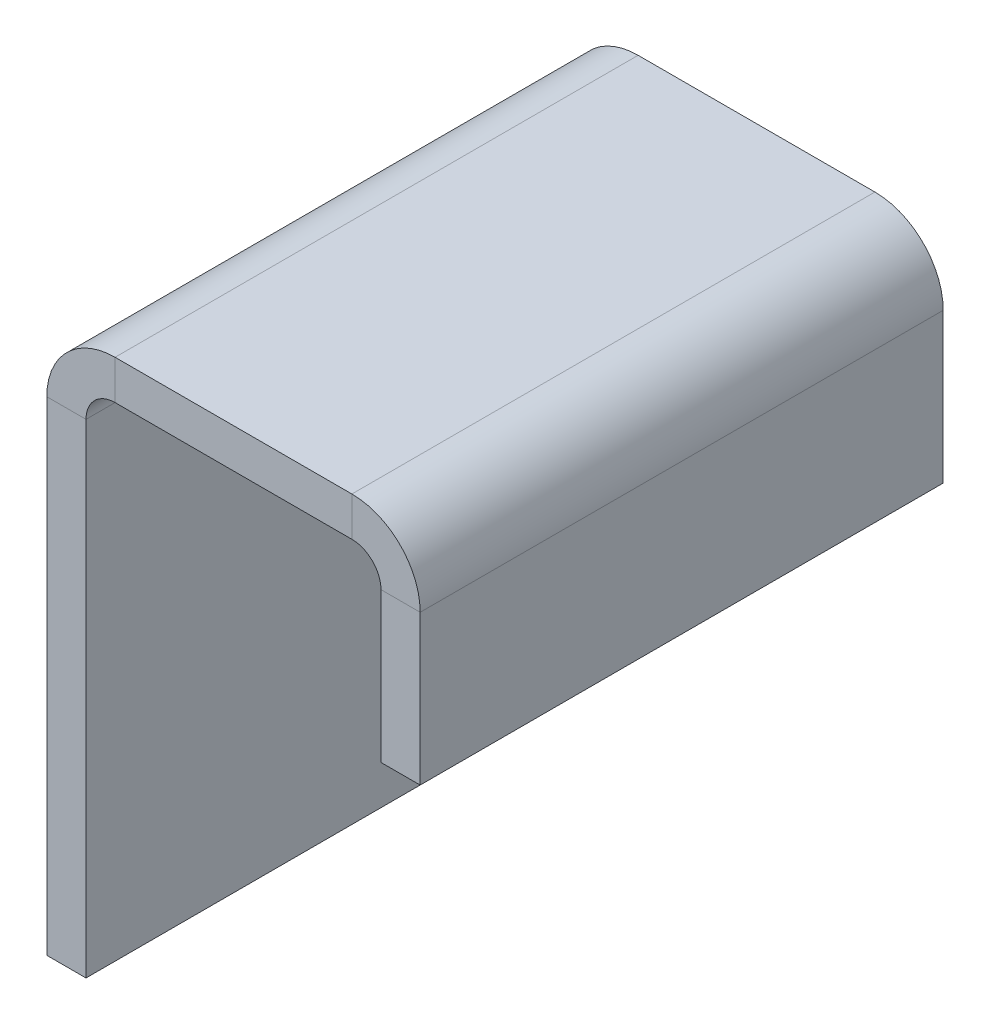
ISO-10303-21;
HEADER;
FILE_DESCRIPTION(('STEP AP214'),'2;1');
FILE_NAME('part.step','',(''),(''),'','','');
FILE_SCHEMA(('AUTOMOTIVE_DESIGN { 1 0 10303 214 1 1 1 1 }'));
ENDSEC;
DATA;
#1=APPLICATION_CONTEXT('core data for automotive mechanical design processes');
#2=APPLICATION_PROTOCOL_DEFINITION('international standard','automotive_design',2000,#1);
#3=PRODUCT_CONTEXT('',#1,'mechanical');
#4=PRODUCT('Part','Part','',(#3));
#5=PRODUCT_RELATED_PRODUCT_CATEGORY('part','',(#4));
#6=PRODUCT_DEFINITION_FORMATION('','',#4);
#7=PRODUCT_DEFINITION_CONTEXT('part definition',#1,'design');
#8=PRODUCT_DEFINITION('design','',#6,#7);
#9=PRODUCT_DEFINITION_SHAPE('','',#8);
#10=(LENGTH_UNIT() NAMED_UNIT(*) SI_UNIT(.MILLI.,.METRE.));
#11=(NAMED_UNIT(*) PLANE_ANGLE_UNIT() SI_UNIT($,.RADIAN.));
#12=(NAMED_UNIT(*) SI_UNIT($,.STERADIAN.) SOLID_ANGLE_UNIT());
#13=UNCERTAINTY_MEASURE_WITH_UNIT(LENGTH_MEASURE(1.E-05),#10,'distance_accuracy_value','');
#14=(GEOMETRIC_REPRESENTATION_CONTEXT(3) GLOBAL_UNCERTAINTY_ASSIGNED_CONTEXT((#13)) GLOBAL_UNIT_ASSIGNED_CONTEXT((#10,
#11,#12)) REPRESENTATION_CONTEXT('',''));
#15=CARTESIAN_POINT('',(0.,0.,0.));
#16=DIRECTION('',(0.,0.,1.));
#17=DIRECTION('',(1.,0.,0.));
#18=AXIS2_PLACEMENT_3D('',#15,#16,#17);
#19=CARTESIAN_POINT('',(4.7,38.,36.));
#20=DIRECTION('',(0.,0.,1.));
#21=DIRECTION('',(1.,0.,0.));
#22=AXIS2_PLACEMENT_3D('',#19,#20,#21);
#23=PLANE('',#22);
#24=DIRECTION('',(0.,-1.,0.));
#25=VECTOR('',#24,1.);
#26=CARTESIAN_POINT('',(4.7,38.,36.));
#27=LINE('',#26,#25);
#28=CARTESIAN_POINT('',(4.7,38.,36.));
#29=VERTEX_POINT('',#28);
#30=CARTESIAN_POINT('',(4.7,35.3,36.));
#31=VERTEX_POINT('',#30);
#32=EDGE_CURVE('E11',#29,#31,#27,.T.);
#33=ORIENTED_EDGE('',*,*,#32,.F.);
#34=CARTESIAN_POINT('',(4.7,33.3,36.));
#35=DIRECTION('',(0.,0.,1.));
#36=DIRECTION('',(1.,0.,0.));
#37=AXIS2_PLACEMENT_3D('',#34,#35,#36);
#38=CIRCLE('',#37,4.7);
#39=CARTESIAN_POINT('',(0.,33.3,36.));
#40=VERTEX_POINT('',#39);
#41=EDGE_CURVE('E245',#40,#29,#38,.F.);
#42=ORIENTED_EDGE('',*,*,#41,.F.);
#43=DIRECTION('',(-1.,0.,0.));
#44=VECTOR('',#43,1.);
#45=CARTESIAN_POINT('',(2.7,33.3,36.));
#46=LINE('',#45,#44);
#47=CARTESIAN_POINT('',(2.7,33.3,36.));
#48=VERTEX_POINT('',#47);
#49=EDGE_CURVE('E43',#48,#40,#46,.T.);
#50=ORIENTED_EDGE('',*,*,#49,.F.);
#51=CARTESIAN_POINT('',(4.7,33.3,36.));
#52=DIRECTION('',(0.,0.,1.));
#53=DIRECTION('',(1.,0.,0.));
#54=AXIS2_PLACEMENT_3D('',#51,#52,#53);
#55=CIRCLE('',#54,2.);
#56=EDGE_CURVE('E144',#48,#31,#55,.F.);
#57=ORIENTED_EDGE('',*,*,#56,.T.);
#58=EDGE_LOOP('',(#33,#42,#50,#57));
#59=FACE_BOUND('',#58,.T.);
#60=ADVANCED_FACE('F35',(#59),#23,.T.);
#61=CARTESIAN_POINT('',(2.7,33.3,36.));
#62=DIRECTION('',(0.,0.,1.));
#63=DIRECTION('',(1.,0.,0.));
#64=AXIS2_PLACEMENT_3D('',#61,#62,#63);
#65=PLANE('',#64);
#66=DIRECTION('',(1.,0.,0.));
#67=VECTOR('',#66,1.);
#68=CARTESIAN_POINT('',(0.,38.,36.));
#69=LINE('',#68,#67);
#70=CARTESIAN_POINT('',(21.,38.,36.));
#71=VERTEX_POINT('',#70);
#72=EDGE_CURVE('E138',#29,#71,#69,.T.);
#73=ORIENTED_EDGE('',*,*,#72,.F.);
#74=ORIENTED_EDGE('',*,*,#32,.T.);
#75=DIRECTION('',(1.,0.,0.));
#76=VECTOR('',#75,1.);
#77=CARTESIAN_POINT('',(0.,35.3,36.));
#78=LINE('',#77,#76);
#79=CARTESIAN_POINT('',(21.,35.3,36.));
#80=VERTEX_POINT('',#79);
#81=EDGE_CURVE('E135',#31,#80,#78,.T.);
#82=ORIENTED_EDGE('',*,*,#81,.T.);
#83=DIRECTION('',(0.,1.,0.));
#84=VECTOR('',#83,1.);
#85=CARTESIAN_POINT('',(21.,35.3,36.));
#86=LINE('',#85,#84);
#87=EDGE_CURVE('E226',#80,#71,#86,.T.);
#88=ORIENTED_EDGE('',*,*,#87,.T.);
#89=EDGE_LOOP('',(#73,#74,#82,#88));
#90=FACE_BOUND('',#89,.T.);
#91=ADVANCED_FACE('F133',(#90),#65,.T.);
#92=CARTESIAN_POINT('',(0.,33.3,0.));
#93=DIRECTION('',(0.,0.,-1.));
#94=DIRECTION('',(-1.,0.,0.));
#95=AXIS2_PLACEMENT_3D('',#92,#93,#94);
#96=PLANE('',#95);
#97=DIRECTION('',(1.,0.,0.));
#98=VECTOR('',#97,1.);
#99=CARTESIAN_POINT('',(0.,33.3,0.));
#100=LINE('',#99,#98);
#101=CARTESIAN_POINT('',(0.,33.3,0.));
#102=VERTEX_POINT('',#101);
#103=CARTESIAN_POINT('',(2.7,33.3,0.));
#104=VERTEX_POINT('',#103);
#105=EDGE_CURVE('E231',#102,#104,#100,.T.);
#106=ORIENTED_EDGE('',*,*,#105,.F.);
#107=CARTESIAN_POINT('',(4.7,33.3,0.));
#108=DIRECTION('',(0.,0.,1.));
#109=DIRECTION('',(1.,0.,0.));
#110=AXIS2_PLACEMENT_3D('',#107,#108,#109);
#111=CIRCLE('',#110,4.7);
#112=CARTESIAN_POINT('',(4.7,38.,0.));
#113=VERTEX_POINT('',#112);
#114=EDGE_CURVE('E183',#102,#113,#111,.F.);
#115=ORIENTED_EDGE('',*,*,#114,.T.);
#116=DIRECTION('',(0.,1.,0.));
#117=VECTOR('',#116,1.);
#118=CARTESIAN_POINT('',(4.7,35.3,0.));
#119=LINE('',#118,#117);
#120=CARTESIAN_POINT('',(4.7,35.3,0.));
#121=VERTEX_POINT('',#120);
#122=EDGE_CURVE('E229',#121,#113,#119,.T.);
#123=ORIENTED_EDGE('',*,*,#122,.F.);
#124=CARTESIAN_POINT('',(4.7,33.3,0.));
#125=DIRECTION('',(0.,0.,1.));
#126=DIRECTION('',(1.,0.,0.));
#127=AXIS2_PLACEMENT_3D('',#124,#125,#126);
#128=CIRCLE('',#127,2.);
#129=EDGE_CURVE('E156',#104,#121,#128,.F.);
#130=ORIENTED_EDGE('',*,*,#129,.F.);
#131=EDGE_LOOP('',(#106,#115,#123,#130));
#132=FACE_BOUND('',#131,.T.);
#133=ADVANCED_FACE('F283',(#132),#96,.T.);
#134=CARTESIAN_POINT('',(4.7,35.3,0.));
#135=DIRECTION('',(0.,0.,-1.));
#136=DIRECTION('',(-1.,0.,0.));
#137=AXIS2_PLACEMENT_3D('',#134,#135,#136);
#138=PLANE('',#137);
#139=DIRECTION('',(0.,1.,0.));
#140=VECTOR('',#139,1.);
#141=CARTESIAN_POINT('',(0.,0.,0.));
#142=LINE('',#141,#140);
#143=CARTESIAN_POINT('',(0.,0.,0.));
#144=VERTEX_POINT('',#143);
#145=EDGE_CURVE('E186',#144,#102,#142,.T.);
#146=ORIENTED_EDGE('',*,*,#145,.T.);
#147=ORIENTED_EDGE('',*,*,#105,.T.);
#148=DIRECTION('',(0.,1.,0.));
#149=VECTOR('',#148,1.);
#150=CARTESIAN_POINT('',(2.7,0.,0.));
#151=LINE('',#150,#149);
#152=CARTESIAN_POINT('',(2.7,0.,0.));
#153=VERTEX_POINT('',#152);
#154=EDGE_CURVE('E192',#153,#104,#151,.T.);
#155=ORIENTED_EDGE('',*,*,#154,.F.);
#156=DIRECTION('',(-1.,0.,0.));
#157=VECTOR('',#156,1.);
#158=CARTESIAN_POINT('',(2.7,0.,0.));
#159=LINE('',#158,#157);
#160=EDGE_CURVE('E189',#153,#144,#159,.T.);
#161=ORIENTED_EDGE('',*,*,#160,.T.);
#162=EDGE_LOOP('',(#146,#147,#155,#161));
#163=FACE_BOUND('',#162,.T.);
#164=ADVANCED_FACE('F286',(#163),#138,.T.);
#165=CARTESIAN_POINT('',(25.7,33.3,36.));
#166=DIRECTION('',(0.,0.,1.));
#167=DIRECTION('',(1.,0.,0.));
#168=AXIS2_PLACEMENT_3D('',#165,#166,#167);
#169=PLANE('',#168);
#170=DIRECTION('',(-1.,0.,0.));
#171=VECTOR('',#170,1.);
#172=CARTESIAN_POINT('',(25.7,33.3,36.));
#173=LINE('',#172,#171);
#174=CARTESIAN_POINT('',(25.7,33.3,36.));
#175=VERTEX_POINT('',#174);
#176=CARTESIAN_POINT('',(23.,33.3,36.));
#177=VERTEX_POINT('',#176);
#178=EDGE_CURVE('E51',#175,#177,#173,.T.);
#179=ORIENTED_EDGE('',*,*,#178,.F.);
#180=CARTESIAN_POINT('',(21.,33.3,36.));
#181=DIRECTION('',(0.,0.,1.));
#182=DIRECTION('',(1.,0.,0.));
#183=AXIS2_PLACEMENT_3D('',#180,#181,#182);
#184=CIRCLE('',#183,4.7);
#185=EDGE_CURVE('E255',#71,#175,#184,.F.);
#186=ORIENTED_EDGE('',*,*,#185,.F.);
#187=ORIENTED_EDGE('',*,*,#87,.F.);
#188=CARTESIAN_POINT('',(21.,33.3,36.));
#189=DIRECTION('',(0.,0.,1.));
#190=DIRECTION('',(1.,0.,0.));
#191=AXIS2_PLACEMENT_3D('',#188,#189,#190);
#192=CIRCLE('',#191,2.);
#193=EDGE_CURVE('E164',#80,#177,#192,.F.);
#194=ORIENTED_EDGE('',*,*,#193,.T.);
#195=EDGE_LOOP('',(#179,#186,#187,#194));
#196=FACE_BOUND('',#195,.T.);
#197=ADVANCED_FACE('F278',(#196),#169,.T.);
#198=CARTESIAN_POINT('',(21.,35.3,36.));
#199=DIRECTION('',(0.,0.,1.));
#200=DIRECTION('',(1.,0.,0.));
#201=AXIS2_PLACEMENT_3D('',#198,#199,#200);
#202=PLANE('',#201);
#203=DIRECTION('',(0.,-1.,0.));
#204=VECTOR('',#203,1.);
#205=CARTESIAN_POINT('',(25.7,38.,36.));
#206=LINE('',#205,#204);
#207=CARTESIAN_POINT('',(25.7,23.,36.));
#208=VERTEX_POINT('',#207);
#209=EDGE_CURVE('E258',#175,#208,#206,.T.);
#210=ORIENTED_EDGE('',*,*,#209,.F.);
#211=ORIENTED_EDGE('',*,*,#178,.T.);
#212=DIRECTION('',(0.,1.,0.));
#213=VECTOR('',#212,1.);
#214=CARTESIAN_POINT('',(23.,38.,36.));
#215=LINE('',#214,#213);
#216=CARTESIAN_POINT('',(23.,23.,36.));
#217=VERTEX_POINT('',#216);
#218=EDGE_CURVE('E105',#177,#217,#215,.F.);
#219=ORIENTED_EDGE('',*,*,#218,.T.);
#220=DIRECTION('',(-1.,0.,0.));
#221=VECTOR('',#220,1.);
#222=CARTESIAN_POINT('',(25.7,23.,36.));
#223=LINE('',#222,#221);
#224=EDGE_CURVE('E261',#208,#217,#223,.T.);
#225=ORIENTED_EDGE('',*,*,#224,.F.);
#226=EDGE_LOOP('',(#210,#211,#219,#225));
#227=FACE_BOUND('',#226,.T.);
#228=ADVANCED_FACE('F267',(#227),#202,.T.);
#229=CARTESIAN_POINT('',(21.,38.,0.));
#230=DIRECTION('',(0.,0.,-1.));
#231=DIRECTION('',(-1.,0.,0.));
#232=AXIS2_PLACEMENT_3D('',#229,#230,#231);
#233=PLANE('',#232);
#234=DIRECTION('',(0.,-1.,0.));
#235=VECTOR('',#234,1.);
#236=CARTESIAN_POINT('',(21.,38.,0.));
#237=LINE('',#236,#235);
#238=CARTESIAN_POINT('',(21.,38.,0.));
#239=VERTEX_POINT('',#238);
#240=CARTESIAN_POINT('',(21.,35.3,0.));
#241=VERTEX_POINT('',#240);
#242=EDGE_CURVE('E92',#239,#241,#237,.T.);
#243=ORIENTED_EDGE('',*,*,#242,.F.);
#244=CARTESIAN_POINT('',(21.,33.3,0.));
#245=DIRECTION('',(0.,0.,1.));
#246=DIRECTION('',(1.,0.,0.));
#247=AXIS2_PLACEMENT_3D('',#244,#245,#246);
#248=CIRCLE('',#247,4.7);
#249=CARTESIAN_POINT('',(25.7,33.3,0.));
#250=VERTEX_POINT('',#249);
#251=EDGE_CURVE('E179',#239,#250,#248,.F.);
#252=ORIENTED_EDGE('',*,*,#251,.T.);
#253=DIRECTION('',(1.,0.,0.));
#254=VECTOR('',#253,1.);
#255=CARTESIAN_POINT('',(23.,33.3,0.));
#256=LINE('',#255,#254);
#257=CARTESIAN_POINT('',(23.,33.3,0.));
#258=VERTEX_POINT('',#257);
#259=EDGE_CURVE('E99',#258,#250,#256,.T.);
#260=ORIENTED_EDGE('',*,*,#259,.F.);
#261=CARTESIAN_POINT('',(21.,33.3,0.));
#262=DIRECTION('',(0.,0.,1.));
#263=DIRECTION('',(1.,0.,0.));
#264=AXIS2_PLACEMENT_3D('',#261,#262,#263);
#265=CIRCLE('',#264,2.);
#266=EDGE_CURVE('E198',#241,#258,#265,.F.);
#267=ORIENTED_EDGE('',*,*,#266,.F.);
#268=EDGE_LOOP('',(#243,#252,#260,#267));
#269=FACE_BOUND('',#268,.T.);
#270=ADVANCED_FACE('F315',(#269),#233,.T.);
#271=CARTESIAN_POINT('',(23.,33.3,0.));
#272=DIRECTION('',(0.,0.,-1.));
#273=DIRECTION('',(-1.,0.,0.));
#274=AXIS2_PLACEMENT_3D('',#271,#272,#273);
#275=PLANE('',#274);
#276=DIRECTION('',(1.,0.,0.));
#277=VECTOR('',#276,1.);
#278=CARTESIAN_POINT('',(0.,38.,0.));
#279=LINE('',#278,#277);
#280=EDGE_CURVE('E181',#113,#239,#279,.T.);
#281=ORIENTED_EDGE('',*,*,#280,.T.);
#282=ORIENTED_EDGE('',*,*,#242,.T.);
#283=DIRECTION('',(1.,0.,0.));
#284=VECTOR('',#283,1.);
#285=CARTESIAN_POINT('',(0.,35.3,0.));
#286=LINE('',#285,#284);
#287=EDGE_CURVE('E196',#121,#241,#286,.T.);
#288=ORIENTED_EDGE('',*,*,#287,.F.);
#289=ORIENTED_EDGE('',*,*,#122,.T.);
#290=EDGE_LOOP('',(#281,#282,#288,#289));
#291=FACE_BOUND('',#290,.T.);
#292=ADVANCED_FACE('F318',(#291),#275,.T.);
#293=CARTESIAN_POINT('',(23.,38.,36.));
#294=DIRECTION('',(1.,0.,0.));
#295=DIRECTION('',(0.,0.,-1.));
#296=AXIS2_PLACEMENT_3D('',#293,#294,#295);
#297=PLANE('',#296);
#298=DIRECTION('',(0.,1.,0.));
#299=VECTOR('',#298,1.);
#300=CARTESIAN_POINT('',(23.,38.,0.));
#301=LINE('',#300,#299);
#302=CARTESIAN_POINT('',(23.,23.,0.));
#303=VERTEX_POINT('',#302);
#304=EDGE_CURVE('E170',#258,#303,#301,.F.);
#305=ORIENTED_EDGE('',*,*,#304,.T.);
#306=DIRECTION('',(0.,0.,-1.));
#307=VECTOR('',#306,1.);
#308=CARTESIAN_POINT('',(23.,23.,36.));
#309=LINE('',#308,#307);
#310=EDGE_CURVE('E222',#217,#303,#309,.T.);
#311=ORIENTED_EDGE('',*,*,#310,.F.);
#312=ORIENTED_EDGE('',*,*,#218,.F.);
#313=DIRECTION('',(0.,0.,-1.));
#314=VECTOR('',#313,1.);
#315=CARTESIAN_POINT('',(23.,33.3,36.));
#316=LINE('',#315,#314);
#317=EDGE_CURVE('E166',#177,#258,#316,.T.);
#318=ORIENTED_EDGE('',*,*,#317,.T.);
#319=EDGE_LOOP('',(#305,#311,#312,#318));
#320=FACE_BOUND('',#319,.T.);
#321=ADVANCED_FACE('F321',(#320),#297,.F.);
#322=CARTESIAN_POINT('',(25.7,23.,36.));
#323=DIRECTION('',(0.,-1.,0.));
#324=DIRECTION('',(1.,0.,0.));
#325=AXIS2_PLACEMENT_3D('',#322,#323,#324);
#326=PLANE('',#325);
#327=DIRECTION('',(-1.,0.,0.));
#328=VECTOR('',#327,1.);
#329=CARTESIAN_POINT('',(25.7,23.,0.));
#330=LINE('',#329,#328);
#331=CARTESIAN_POINT('',(25.7,23.,0.));
#332=VERTEX_POINT('',#331);
#333=EDGE_CURVE('E173',#332,#303,#330,.T.);
#334=ORIENTED_EDGE('',*,*,#333,.F.);
#335=DIRECTION('',(0.,0.,-1.));
#336=VECTOR('',#335,1.);
#337=CARTESIAN_POINT('',(25.7,23.,36.));
#338=LINE('',#337,#336);
#339=EDGE_CURVE('E220',#208,#332,#338,.T.);
#340=ORIENTED_EDGE('',*,*,#339,.F.);
#341=ORIENTED_EDGE('',*,*,#224,.T.);
#342=ORIENTED_EDGE('',*,*,#310,.T.);
#343=EDGE_LOOP('',(#334,#340,#341,#342));
#344=FACE_BOUND('',#343,.T.);
#345=ADVANCED_FACE('F266',(#344),#326,.T.);
#346=CARTESIAN_POINT('',(25.7,38.,36.));
#347=DIRECTION('',(1.,0.,0.));
#348=DIRECTION('',(0.,0.,-1.));
#349=AXIS2_PLACEMENT_3D('',#346,#347,#348);
#350=PLANE('',#349);
#351=DIRECTION('',(0.,-1.,0.));
#352=VECTOR('',#351,1.);
#353=CARTESIAN_POINT('',(25.7,38.,0.));
#354=LINE('',#353,#352);
#355=EDGE_CURVE('E176',#250,#332,#354,.T.);
#356=ORIENTED_EDGE('',*,*,#355,.F.);
#357=DIRECTION('',(0.,0.,-1.));
#358=VECTOR('',#357,1.);
#359=CARTESIAN_POINT('',(25.7,33.3,36.));
#360=LINE('',#359,#358);
#361=EDGE_CURVE('E217',#175,#250,#360,.T.);
#362=ORIENTED_EDGE('',*,*,#361,.F.);
#363=ORIENTED_EDGE('',*,*,#209,.T.);
#364=ORIENTED_EDGE('',*,*,#339,.T.);
#365=EDGE_LOOP('',(#356,#362,#363,#364));
#366=FACE_BOUND('',#365,.T.);
#367=ADVANCED_FACE('F271',(#366),#350,.T.);
#368=CARTESIAN_POINT('',(21.,33.3,36.));
#369=DIRECTION('',(0.,0.,-1.));
#370=DIRECTION('',(-1.,0.,0.));
#371=AXIS2_PLACEMENT_3D('',#368,#369,#370);
#372=CYLINDRICAL_SURFACE('',#371,4.7);
#373=ORIENTED_EDGE('',*,*,#251,.F.);
#374=DIRECTION('',(0.,0.,-1.));
#375=VECTOR('',#374,1.);
#376=CARTESIAN_POINT('',(21.,38.,36.));
#377=LINE('',#376,#375);
#378=EDGE_CURVE('E214',#71,#239,#377,.T.);
#379=ORIENTED_EDGE('',*,*,#378,.F.);
#380=ORIENTED_EDGE('',*,*,#185,.T.);
#381=ORIENTED_EDGE('',*,*,#361,.T.);
#382=EDGE_LOOP('',(#373,#379,#380,#381));
#383=FACE_BOUND('',#382,.T.);
#384=ADVANCED_FACE('F274',(#383),#372,.T.);
#385=CARTESIAN_POINT('',(0.,38.,36.));
#386=DIRECTION('',(0.,1.,0.));
#387=DIRECTION('',(0.,0.,1.));
#388=AXIS2_PLACEMENT_3D('',#385,#386,#387);
#389=PLANE('',#388);
#390=ORIENTED_EDGE('',*,*,#280,.F.);
#391=DIRECTION('',(0.,0.,-1.));
#392=VECTOR('',#391,1.);
#393=CARTESIAN_POINT('',(4.7,38.,36.));
#394=LINE('',#393,#392);
#395=EDGE_CURVE('E211',#29,#113,#394,.T.);
#396=ORIENTED_EDGE('',*,*,#395,.F.);
#397=ORIENTED_EDGE('',*,*,#72,.T.);
#398=ORIENTED_EDGE('',*,*,#378,.T.);
#399=EDGE_LOOP('',(#390,#396,#397,#398));
#400=FACE_BOUND('',#399,.T.);
#401=ADVANCED_FACE('F281',(#400),#389,.T.);
#402=CARTESIAN_POINT('',(4.7,33.3,36.));
#403=DIRECTION('',(0.,0.,-1.));
#404=DIRECTION('',(-1.,0.,0.));
#405=AXIS2_PLACEMENT_3D('',#402,#403,#404);
#406=CYLINDRICAL_SURFACE('',#405,4.7);
#407=ORIENTED_EDGE('',*,*,#114,.F.);
#408=DIRECTION('',(0.,0.,-1.));
#409=VECTOR('',#408,1.);
#410=CARTESIAN_POINT('',(0.,33.3,36.));
#411=LINE('',#410,#409);
#412=EDGE_CURVE('E208',#40,#102,#411,.T.);
#413=ORIENTED_EDGE('',*,*,#412,.F.);
#414=ORIENTED_EDGE('',*,*,#41,.T.);
#415=ORIENTED_EDGE('',*,*,#395,.T.);
#416=EDGE_LOOP('',(#407,#413,#414,#415));
#417=FACE_BOUND('',#416,.T.);
#418=ADVANCED_FACE('F244',(#417),#406,.T.);
#419=CARTESIAN_POINT('',(0.,0.,36.));
#420=DIRECTION('',(-1.,0.,0.));
#421=DIRECTION('',(0.,0.,1.));
#422=AXIS2_PLACEMENT_3D('',#419,#420,#421);
#423=PLANE('',#422);
#424=ORIENTED_EDGE('',*,*,#145,.F.);
#425=DIRECTION('',(0.,0.,-1.));
#426=VECTOR('',#425,1.);
#427=CARTESIAN_POINT('',(0.,0.,36.));
#428=LINE('',#427,#426);
#429=CARTESIAN_POINT('',(0.,0.,36.));
#430=VERTEX_POINT('',#429);
#431=EDGE_CURVE('E206',#430,#144,#428,.T.);
#432=ORIENTED_EDGE('',*,*,#431,.F.);
#433=DIRECTION('',(0.,1.,0.));
#434=VECTOR('',#433,1.);
#435=CARTESIAN_POINT('',(0.,0.,36.));
#436=LINE('',#435,#434);
#437=EDGE_CURVE('E238',#430,#40,#436,.T.);
#438=ORIENTED_EDGE('',*,*,#437,.T.);
#439=ORIENTED_EDGE('',*,*,#412,.T.);
#440=EDGE_LOOP('',(#424,#432,#438,#439));
#441=FACE_BOUND('',#440,.T.);
#442=ADVANCED_FACE('F249',(#441),#423,.T.);
#443=CARTESIAN_POINT('',(2.7,0.,36.));
#444=DIRECTION('',(0.,-1.,0.));
#445=DIRECTION('',(0.,0.,-1.));
#446=AXIS2_PLACEMENT_3D('',#443,#444,#445);
#447=PLANE('',#446);
#448=ORIENTED_EDGE('',*,*,#160,.F.);
#449=DIRECTION('',(0.,0.,-1.));
#450=VECTOR('',#449,1.);
#451=CARTESIAN_POINT('',(2.7,0.,36.));
#452=LINE('',#451,#450);
#453=CARTESIAN_POINT('',(2.7,0.,36.));
#454=VERTEX_POINT('',#453);
#455=EDGE_CURVE('E204',#454,#153,#452,.T.);
#456=ORIENTED_EDGE('',*,*,#455,.F.);
#457=DIRECTION('',(-1.,0.,0.));
#458=VECTOR('',#457,1.);
#459=CARTESIAN_POINT('',(2.7,0.,36.));
#460=LINE('',#459,#458);
#461=EDGE_CURVE('E250',#454,#430,#460,.T.);
#462=ORIENTED_EDGE('',*,*,#461,.T.);
#463=ORIENTED_EDGE('',*,*,#431,.T.);
#464=EDGE_LOOP('',(#448,#456,#462,#463));
#465=FACE_BOUND('',#464,.T.);
#466=ADVANCED_FACE('F291',(#465),#447,.T.);
#467=CARTESIAN_POINT('',(2.7,0.,36.));
#468=DIRECTION('',(-1.,0.,0.));
#469=DIRECTION('',(0.,0.,1.));
#470=AXIS2_PLACEMENT_3D('',#467,#468,#469);
#471=PLANE('',#470);
#472=ORIENTED_EDGE('',*,*,#154,.T.);
#473=DIRECTION('',(0.,0.,-1.));
#474=VECTOR('',#473,1.);
#475=CARTESIAN_POINT('',(2.7,33.3,36.));
#476=LINE('',#475,#474);
#477=EDGE_CURVE('E158',#48,#104,#476,.T.);
#478=ORIENTED_EDGE('',*,*,#477,.F.);
#479=DIRECTION('',(0.,1.,0.));
#480=VECTOR('',#479,1.);
#481=CARTESIAN_POINT('',(2.7,0.,36.));
#482=LINE('',#481,#480);
#483=EDGE_CURVE('E149',#454,#48,#482,.T.);
#484=ORIENTED_EDGE('',*,*,#483,.F.);
#485=ORIENTED_EDGE('',*,*,#455,.T.);
#486=EDGE_LOOP('',(#472,#478,#484,#485));
#487=FACE_BOUND('',#486,.T.);
#488=ADVANCED_FACE('F289',(#487),#471,.F.);
#489=CARTESIAN_POINT('',(4.7,33.3,36.));
#490=DIRECTION('',(0.,0.,-1.));
#491=DIRECTION('',(-1.,0.,0.));
#492=AXIS2_PLACEMENT_3D('',#489,#490,#491);
#493=CYLINDRICAL_SURFACE('',#492,2.);
#494=ORIENTED_EDGE('',*,*,#129,.T.);
#495=DIRECTION('',(0.,0.,-1.));
#496=VECTOR('',#495,1.);
#497=CARTESIAN_POINT('',(4.7,35.3,36.));
#498=LINE('',#497,#496);
#499=EDGE_CURVE('E153',#31,#121,#498,.T.);
#500=ORIENTED_EDGE('',*,*,#499,.F.);
#501=ORIENTED_EDGE('',*,*,#56,.F.);
#502=ORIENTED_EDGE('',*,*,#477,.T.);
#503=EDGE_LOOP('',(#494,#500,#501,#502));
#504=FACE_BOUND('',#503,.T.);
#505=ADVANCED_FACE('F154',(#504),#493,.F.);
#506=CARTESIAN_POINT('',(0.,35.3,36.));
#507=DIRECTION('',(0.,1.,0.));
#508=DIRECTION('',(0.,0.,1.));
#509=AXIS2_PLACEMENT_3D('',#506,#507,#508);
#510=PLANE('',#509);
#511=ORIENTED_EDGE('',*,*,#287,.T.);
#512=DIRECTION('',(0.,0.,-1.));
#513=VECTOR('',#512,1.);
#514=CARTESIAN_POINT('',(21.,35.3,36.));
#515=LINE('',#514,#513);
#516=EDGE_CURVE('E159',#80,#241,#515,.T.);
#517=ORIENTED_EDGE('',*,*,#516,.F.);
#518=ORIENTED_EDGE('',*,*,#81,.F.);
#519=ORIENTED_EDGE('',*,*,#499,.T.);
#520=EDGE_LOOP('',(#511,#517,#518,#519));
#521=FACE_BOUND('',#520,.T.);
#522=ADVANCED_FACE('F161',(#521),#510,.F.);
#523=CARTESIAN_POINT('',(21.,33.3,36.));
#524=DIRECTION('',(0.,0.,-1.));
#525=DIRECTION('',(-1.,0.,0.));
#526=AXIS2_PLACEMENT_3D('',#523,#524,#525);
#527=CYLINDRICAL_SURFACE('',#526,2.);
#528=ORIENTED_EDGE('',*,*,#266,.T.);
#529=ORIENTED_EDGE('',*,*,#317,.F.);
#530=ORIENTED_EDGE('',*,*,#193,.F.);
#531=ORIENTED_EDGE('',*,*,#516,.T.);
#532=EDGE_LOOP('',(#528,#529,#530,#531));
#533=FACE_BOUND('',#532,.T.);
#534=ADVANCED_FACE('F373',(#533),#527,.F.);
#535=CARTESIAN_POINT('',(21.,33.3,36.));
#536=DIRECTION('',(0.,0.,1.));
#537=DIRECTION('',(1.,0.,0.));
#538=AXIS2_PLACEMENT_3D('',#535,#536,#537);
#539=PLANE('',#538);
#540=ORIENTED_EDGE('',*,*,#483,.T.);
#541=ORIENTED_EDGE('',*,*,#49,.T.);
#542=ORIENTED_EDGE('',*,*,#437,.F.);
#543=ORIENTED_EDGE('',*,*,#461,.F.);
#544=EDGE_LOOP('',(#540,#541,#542,#543));
#545=FACE_BOUND('',#544,.T.);
#546=ADVANCED_FACE('F235',(#545),#539,.T.);
#547=CARTESIAN_POINT('',(21.,33.3,0.));
#548=DIRECTION('',(0.,0.,1.));
#549=DIRECTION('',(1.,0.,0.));
#550=AXIS2_PLACEMENT_3D('',#547,#548,#549);
#551=PLANE('',#550);
#552=ORIENTED_EDGE('',*,*,#304,.F.);
#553=ORIENTED_EDGE('',*,*,#259,.T.);
#554=ORIENTED_EDGE('',*,*,#355,.T.);
#555=ORIENTED_EDGE('',*,*,#333,.T.);
#556=EDGE_LOOP('',(#552,#553,#554,#555));
#557=FACE_BOUND('',#556,.T.);
#558=ADVANCED_FACE('F393',(#557),#551,.F.);
#559=CLOSED_SHELL('',(#60,#91,#133,#164,#197,#228,#270,#292,#321,#345,#367,#384,#401,#418,#442,
#466,#488,#505,#522,#534,#546,#558));
#560=MANIFOLD_SOLID_BREP('B2',#559);
#561=ADVANCED_BREP_SHAPE_REPRESENTATION('',(#18,#560),#14);
#562=SHAPE_DEFINITION_REPRESENTATION(#9,#561);
ENDSEC;
END-ISO-10303-21;
